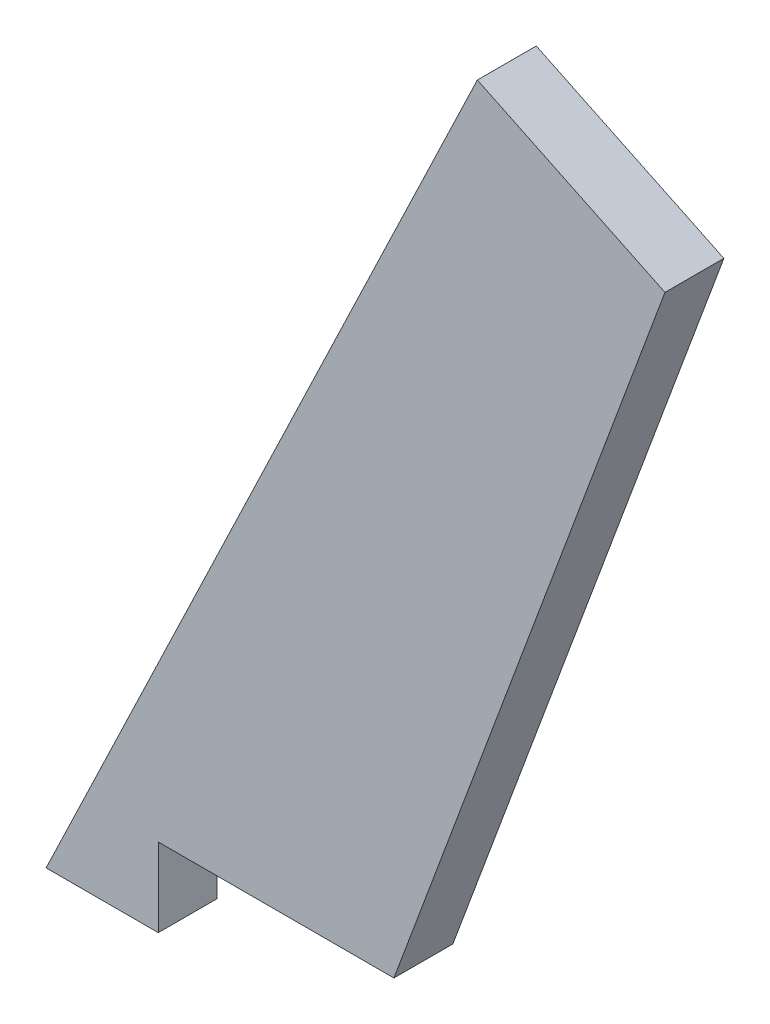
ISO-10303-21;
HEADER;
FILE_DESCRIPTION(('STEP AP214'),'2;1');
FILE_NAME('part.step','',(''),(''),'','','');
FILE_SCHEMA(('AUTOMOTIVE_DESIGN { 1 0 10303 214 1 1 1 1 }'));
ENDSEC;
DATA;
#1=APPLICATION_CONTEXT('core data for automotive mechanical design processes');
#2=APPLICATION_PROTOCOL_DEFINITION('international standard','automotive_design',2000,#1);
#3=PRODUCT_CONTEXT('',#1,'mechanical');
#4=PRODUCT('Part','Part','',(#3));
#5=PRODUCT_RELATED_PRODUCT_CATEGORY('part','',(#4));
#6=PRODUCT_DEFINITION_FORMATION('','',#4);
#7=PRODUCT_DEFINITION_CONTEXT('part definition',#1,'design');
#8=PRODUCT_DEFINITION('design','',#6,#7);
#9=PRODUCT_DEFINITION_SHAPE('','',#8);
#10=(LENGTH_UNIT() NAMED_UNIT(*) SI_UNIT(.MILLI.,.METRE.));
#11=(NAMED_UNIT(*) PLANE_ANGLE_UNIT() SI_UNIT($,.RADIAN.));
#12=(NAMED_UNIT(*) SI_UNIT($,.STERADIAN.) SOLID_ANGLE_UNIT());
#13=UNCERTAINTY_MEASURE_WITH_UNIT(LENGTH_MEASURE(1.E-05),#10,'distance_accuracy_value','');
#14=(GEOMETRIC_REPRESENTATION_CONTEXT(3) GLOBAL_UNCERTAINTY_ASSIGNED_CONTEXT((#13)) GLOBAL_UNIT_ASSIGNED_CONTEXT((#10,
#11,#12)) REPRESENTATION_CONTEXT('',''));
#15=CARTESIAN_POINT('',(0.,0.,0.));
#16=DIRECTION('',(0.,0.,1.));
#17=DIRECTION('',(1.,0.,0.));
#18=AXIS2_PLACEMENT_3D('',#15,#16,#17);
#19=CARTESIAN_POINT('',(0.,0.,9.525));
#20=DIRECTION('',(0.,1.,0.));
#21=DIRECTION('',(0.,0.,1.));
#22=AXIS2_PLACEMENT_3D('',#19,#20,#21);
#23=PLANE('',#22);
#24=DIRECTION('',(1.,0.,0.));
#25=VECTOR('',#24,1.);
#26=CARTESIAN_POINT('',(0.,0.,0.));
#27=LINE('',#26,#25);
#28=CARTESIAN_POINT('',(0.,0.,0.));
#29=VERTEX_POINT('',#28);
#30=CARTESIAN_POINT('',(18.1408962044007,0.,0.));
#31=VERTEX_POINT('',#30);
#32=EDGE_CURVE('E127',#29,#31,#27,.T.);
#33=ORIENTED_EDGE('',*,*,#32,.T.);
#34=DIRECTION('',(0.,0.,-1.));
#35=VECTOR('',#34,1.);
#36=CARTESIAN_POINT('',(18.1408962044007,0.,9.525));
#37=LINE('',#36,#35);
#38=CARTESIAN_POINT('',(18.1408962044007,0.,9.525));
#39=VERTEX_POINT('',#38);
#40=EDGE_CURVE('E11',#39,#31,#37,.T.);
#41=ORIENTED_EDGE('',*,*,#40,.F.);
#42=DIRECTION('',(1.,0.,0.));
#43=VECTOR('',#42,1.);
#44=CARTESIAN_POINT('',(0.,0.,9.525));
#45=LINE('',#44,#43);
#46=CARTESIAN_POINT('',(0.,0.,9.525));
#47=VERTEX_POINT('',#46);
#48=EDGE_CURVE('E137',#47,#39,#45,.T.);
#49=ORIENTED_EDGE('',*,*,#48,.F.);
#50=DIRECTION('',(0.,0.,-1.));
#51=VECTOR('',#50,1.);
#52=CARTESIAN_POINT('',(0.,0.,9.525));
#53=LINE('',#52,#51);
#54=EDGE_CURVE('E123',#47,#29,#53,.T.);
#55=ORIENTED_EDGE('',*,*,#54,.T.);
#56=EDGE_LOOP('',(#33,#41,#49,#55));
#57=FACE_BOUND('',#56,.T.);
#58=ADVANCED_FACE('F43',(#57),#23,.F.);
#59=CARTESIAN_POINT('',(18.1408962044007,0.,9.525));
#60=DIRECTION('',(-1.,0.,0.));
#61=DIRECTION('',(0.,0.,1.));
#62=AXIS2_PLACEMENT_3D('',#59,#60,#61);
#63=PLANE('',#62);
#64=DIRECTION('',(0.,1.,0.));
#65=VECTOR('',#64,1.);
#66=CARTESIAN_POINT('',(18.1408962044007,0.,0.));
#67=LINE('',#66,#65);
#68=CARTESIAN_POINT('',(18.1408962044007,12.7,0.));
#69=VERTEX_POINT('',#68);
#70=EDGE_CURVE('E130',#31,#69,#67,.T.);
#71=ORIENTED_EDGE('',*,*,#70,.T.);
#72=DIRECTION('',(0.,0.,-1.));
#73=VECTOR('',#72,1.);
#74=CARTESIAN_POINT('',(18.1408962044007,12.7,9.525));
#75=LINE('',#74,#73);
#76=CARTESIAN_POINT('',(18.1408962044007,12.7,9.525));
#77=VERTEX_POINT('',#76);
#78=EDGE_CURVE('E51',#77,#69,#75,.T.);
#79=ORIENTED_EDGE('',*,*,#78,.F.);
#80=DIRECTION('',(0.,1.,0.));
#81=VECTOR('',#80,1.);
#82=CARTESIAN_POINT('',(18.1408962044007,0.,9.525));
#83=LINE('',#82,#81);
#84=EDGE_CURVE('E96',#39,#77,#83,.T.);
#85=ORIENTED_EDGE('',*,*,#84,.F.);
#86=ORIENTED_EDGE('',*,*,#40,.T.);
#87=EDGE_LOOP('',(#71,#79,#85,#86));
#88=FACE_BOUND('',#87,.T.);
#89=ADVANCED_FACE('F161',(#88),#63,.F.);
#90=CARTESIAN_POINT('',(18.1408962044007,12.7,9.525));
#91=DIRECTION('',(0.,1.,0.));
#92=DIRECTION('',(0.,0.,1.));
#93=AXIS2_PLACEMENT_3D('',#90,#91,#92);
#94=PLANE('',#93);
#95=DIRECTION('',(1.,0.,0.));
#96=VECTOR('',#95,1.);
#97=CARTESIAN_POINT('',(18.1408962044007,12.7,0.));
#98=LINE('',#97,#96);
#99=CARTESIAN_POINT('',(56.2408962044007,12.7,0.));
#100=VERTEX_POINT('',#99);
#101=EDGE_CURVE('E132',#69,#100,#98,.T.);
#102=ORIENTED_EDGE('',*,*,#101,.T.);
#103=DIRECTION('',(0.,0.,-1.));
#104=VECTOR('',#103,1.);
#105=CARTESIAN_POINT('',(56.2408962044007,12.7,9.525));
#106=LINE('',#105,#104);
#107=CARTESIAN_POINT('',(56.2408962044007,12.7,9.525));
#108=VERTEX_POINT('',#107);
#109=EDGE_CURVE('E118',#108,#100,#106,.T.);
#110=ORIENTED_EDGE('',*,*,#109,.F.);
#111=DIRECTION('',(1.,0.,0.));
#112=VECTOR('',#111,1.);
#113=CARTESIAN_POINT('',(18.1408962044007,12.7,9.525));
#114=LINE('',#113,#112);
#115=EDGE_CURVE('E109',#77,#108,#114,.T.);
#116=ORIENTED_EDGE('',*,*,#115,.F.);
#117=ORIENTED_EDGE('',*,*,#78,.T.);
#118=EDGE_LOOP('',(#102,#110,#116,#117));
#119=FACE_BOUND('',#118,.T.);
#120=ADVANCED_FACE('F143',(#119),#94,.F.);
#121=CARTESIAN_POINT('',(56.2408962044007,12.7,9.525));
#122=DIRECTION('',(-0.937352592216018,0.348382143437218,0.));
#123=DIRECTION('',(-0.348382143437218,-0.937352592216019,0.));
#124=AXIS2_PLACEMENT_3D('',#121,#122,#123);
#125=PLANE('',#124);
#126=DIRECTION('',(0.348382143437218,0.937352592216018,0.));
#127=VECTOR('',#126,1.);
#128=CARTESIAN_POINT('',(56.2408962044007,12.7,0.));
#129=LINE('',#128,#127);
#130=CARTESIAN_POINT('',(100.070510436605,130.627406126624,0.));
#131=VERTEX_POINT('',#130);
#132=EDGE_CURVE('E117',#100,#131,#129,.T.);
#133=ORIENTED_EDGE('',*,*,#132,.T.);
#134=DIRECTION('',(0.,0.,-1.));
#135=VECTOR('',#134,1.);
#136=CARTESIAN_POINT('',(100.070510436605,130.627406126624,9.525));
#137=LINE('',#136,#135);
#138=CARTESIAN_POINT('',(100.070510436605,130.627406126624,9.525));
#139=VERTEX_POINT('',#138);
#140=EDGE_CURVE('E114',#139,#131,#137,.T.);
#141=ORIENTED_EDGE('',*,*,#140,.F.);
#142=DIRECTION('',(0.348382143437218,0.937352592216018,0.));
#143=VECTOR('',#142,1.);
#144=CARTESIAN_POINT('',(56.2408962044007,12.7,9.525));
#145=LINE('',#144,#143);
#146=EDGE_CURVE('E103',#108,#139,#145,.T.);
#147=ORIENTED_EDGE('',*,*,#146,.F.);
#148=ORIENTED_EDGE('',*,*,#109,.T.);
#149=EDGE_LOOP('',(#133,#141,#147,#148));
#150=FACE_BOUND('',#149,.T.);
#151=ADVANCED_FACE('F115',(#150),#125,.F.);
#152=CARTESIAN_POINT('',(100.070510436605,130.627406126624,9.525));
#153=DIRECTION('',(-0.432923236283567,-0.901430791290026,0.));
#154=DIRECTION('',(0.901430791290026,-0.432923236283567,0.));
#155=AXIS2_PLACEMENT_3D('',#152,#153,#154);
#156=PLANE('',#155);
#157=DIRECTION('',(-0.901430791290026,0.432923236283567,0.));
#158=VECTOR('',#157,1.);
#159=CARTESIAN_POINT('',(100.070510436605,130.627406126624,0.));
#160=LINE('',#159,#158);
#161=CARTESIAN_POINT('',(69.7328571557391,145.197437643748,0.));
#162=VERTEX_POINT('',#161);
#163=EDGE_CURVE('E82',#131,#162,#160,.T.);
#164=ORIENTED_EDGE('',*,*,#163,.T.);
#165=DIRECTION('',(0.,0.,-1.));
#166=VECTOR('',#165,1.);
#167=CARTESIAN_POINT('',(69.7328571557391,145.197437643748,9.525));
#168=LINE('',#167,#166);
#169=CARTESIAN_POINT('',(69.7328571557391,145.197437643748,9.525));
#170=VERTEX_POINT('',#169);
#171=EDGE_CURVE('E119',#170,#162,#168,.T.);
#172=ORIENTED_EDGE('',*,*,#171,.F.);
#173=DIRECTION('',(-0.901430791290026,0.432923236283567,0.));
#174=VECTOR('',#173,1.);
#175=CARTESIAN_POINT('',(100.070510436605,130.627406126624,9.525));
#176=LINE('',#175,#174);
#177=EDGE_CURVE('E107',#139,#170,#176,.T.);
#178=ORIENTED_EDGE('',*,*,#177,.F.);
#179=ORIENTED_EDGE('',*,*,#140,.T.);
#180=EDGE_LOOP('',(#164,#172,#178,#179));
#181=FACE_BOUND('',#180,.T.);
#182=ADVANCED_FACE('F121',(#181),#156,.F.);
#183=CARTESIAN_POINT('',(69.7328571557391,145.197437643748,9.525));
#184=DIRECTION('',(0.901430791290027,-0.432923236283564,0.));
#185=DIRECTION('',(0.432923236283564,0.901430791290027,0.));
#186=AXIS2_PLACEMENT_3D('',#183,#184,#185);
#187=PLANE('',#186);
#188=DIRECTION('',(-0.432923236283565,-0.901430791290027,0.));
#189=VECTOR('',#188,1.);
#190=CARTESIAN_POINT('',(69.7328571557391,145.197437643748,0.));
#191=LINE('',#190,#189);
#192=EDGE_CURVE('E88',#162,#29,#191,.T.);
#193=ORIENTED_EDGE('',*,*,#192,.T.);
#194=ORIENTED_EDGE('',*,*,#54,.F.);
#195=DIRECTION('',(-0.432923236283565,-0.901430791290027,0.));
#196=VECTOR('',#195,1.);
#197=CARTESIAN_POINT('',(69.7328571557391,145.197437643748,9.525));
#198=LINE('',#197,#196);
#199=EDGE_CURVE('E59',#170,#47,#198,.T.);
#200=ORIENTED_EDGE('',*,*,#199,.F.);
#201=ORIENTED_EDGE('',*,*,#171,.T.);
#202=EDGE_LOOP('',(#193,#194,#200,#201));
#203=FACE_BOUND('',#202,.T.);
#204=ADVANCED_FACE('F150',(#203),#187,.F.);
#205=CARTESIAN_POINT('',(0.,0.,9.525));
#206=DIRECTION('',(0.,0.,1.));
#207=DIRECTION('',(1.,0.,0.));
#208=AXIS2_PLACEMENT_3D('',#205,#206,#207);
#209=PLANE('',#208);
#210=ORIENTED_EDGE('',*,*,#48,.T.);
#211=ORIENTED_EDGE('',*,*,#84,.T.);
#212=ORIENTED_EDGE('',*,*,#115,.T.);
#213=ORIENTED_EDGE('',*,*,#146,.T.);
#214=ORIENTED_EDGE('',*,*,#177,.T.);
#215=ORIENTED_EDGE('',*,*,#199,.T.);
#216=EDGE_LOOP('',(#210,#211,#212,#213,#214,#215));
#217=FACE_BOUND('',#216,.T.);
#218=ADVANCED_FACE('F105',(#217),#209,.T.);
#219=CARTESIAN_POINT('',(0.,0.,0.));
#220=DIRECTION('',(0.,0.,1.));
#221=DIRECTION('',(1.,0.,0.));
#222=AXIS2_PLACEMENT_3D('',#219,#220,#221);
#223=PLANE('',#222);
#224=ORIENTED_EDGE('',*,*,#32,.F.);
#225=ORIENTED_EDGE('',*,*,#192,.F.);
#226=ORIENTED_EDGE('',*,*,#163,.F.);
#227=ORIENTED_EDGE('',*,*,#132,.F.);
#228=ORIENTED_EDGE('',*,*,#101,.F.);
#229=ORIENTED_EDGE('',*,*,#70,.F.);
#230=EDGE_LOOP('',(#224,#225,#226,#227,#228,#229));
#231=FACE_BOUND('',#230,.T.);
#232=ADVANCED_FACE('F146',(#231),#223,.F.);
#233=CLOSED_SHELL('',(#58,#89,#120,#151,#182,#204,#218,#232));
#234=MANIFOLD_SOLID_BREP('B2',#233);
#235=ADVANCED_BREP_SHAPE_REPRESENTATION('',(#18,#234),#14);
#236=SHAPE_DEFINITION_REPRESENTATION(#9,#235);
ENDSEC;
END-ISO-10303-21;
